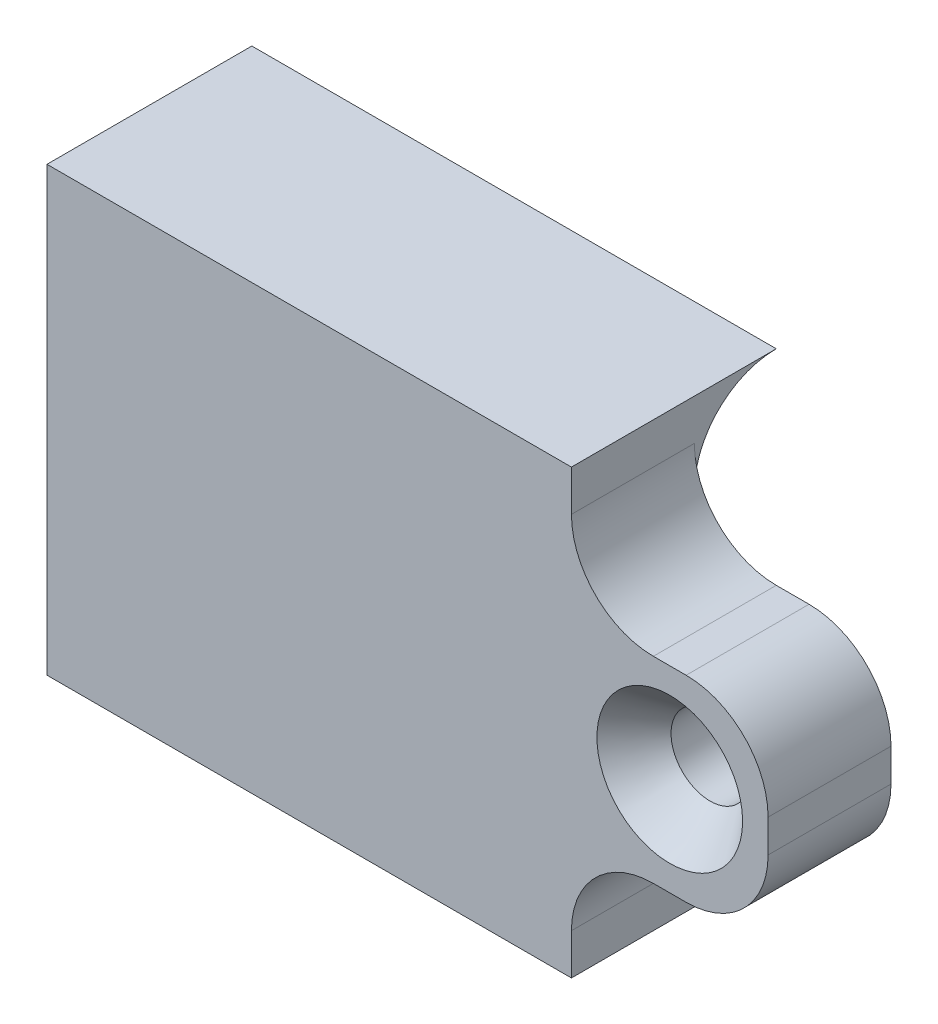
ISO-10303-21;
HEADER;
FILE_DESCRIPTION(('STEP AP214'),'2;1');
FILE_NAME('part.step','',(''),(''),'','','');
FILE_SCHEMA(('AUTOMOTIVE_DESIGN { 1 0 10303 214 1 1 1 1 }'));
ENDSEC;
DATA;
#1=APPLICATION_CONTEXT('core data for automotive mechanical design processes');
#2=APPLICATION_PROTOCOL_DEFINITION('international standard','automotive_design',2000,#1);
#3=PRODUCT_CONTEXT('',#1,'mechanical');
#4=PRODUCT('Part','Part','',(#3));
#5=PRODUCT_RELATED_PRODUCT_CATEGORY('part','',(#4));
#6=PRODUCT_DEFINITION_FORMATION('','',#4);
#7=PRODUCT_DEFINITION_CONTEXT('part definition',#1,'design');
#8=PRODUCT_DEFINITION('design','',#6,#7);
#9=PRODUCT_DEFINITION_SHAPE('','',#8);
#10=(LENGTH_UNIT() NAMED_UNIT(*) SI_UNIT(.MILLI.,.METRE.));
#11=(NAMED_UNIT(*) PLANE_ANGLE_UNIT() SI_UNIT($,.RADIAN.));
#12=(NAMED_UNIT(*) SI_UNIT($,.STERADIAN.) SOLID_ANGLE_UNIT());
#13=UNCERTAINTY_MEASURE_WITH_UNIT(LENGTH_MEASURE(1.E-05),#10,'distance_accuracy_value','');
#14=(GEOMETRIC_REPRESENTATION_CONTEXT(3) GLOBAL_UNCERTAINTY_ASSIGNED_CONTEXT((#13)) GLOBAL_UNIT_ASSIGNED_CONTEXT((#10,
#11,#12)) REPRESENTATION_CONTEXT('',''));
#15=CARTESIAN_POINT('',(0.,0.,0.));
#16=DIRECTION('',(0.,0.,1.));
#17=DIRECTION('',(1.,0.,0.));
#18=AXIS2_PLACEMENT_3D('',#15,#16,#17);
#19=CARTESIAN_POINT('',(0.,0.,-1.5));
#20=DIRECTION('',(0.,0.,1.));
#21=DIRECTION('',(1.,0.,0.));
#22=AXIS2_PLACEMENT_3D('',#19,#20,#21);
#23=PLANE('',#22);
#24=CARTESIAN_POINT('',(8.8,0.,-1.5));
#25=DIRECTION('',(0.,0.,1.));
#26=DIRECTION('',(1.,0.,0.));
#27=AXIS2_PLACEMENT_3D('',#24,#25,#26);
#28=CIRCLE('',#27,0.952499999999999);
#29=CARTESIAN_POINT('',(9.7525,0.,-1.5));
#30=VERTEX_POINT('',#29);
#31=EDGE_CURVE('E182',#30,#30,#28,.T.);
#32=ORIENTED_EDGE('',*,*,#31,.T.);
#33=EDGE_LOOP('',(#32));
#34=FACE_BOUND('',#33,.T.);
#35=DIRECTION('',(0.,-1.,0.));
#36=VECTOR('',#35,1.);
#37=CARTESIAN_POINT('',(6.4,-5.4,-1.5));
#38=LINE('',#37,#36);
#39=CARTESIAN_POINT('',(6.4,-3.4,-1.5));
#40=VERTEX_POINT('',#39);
#41=CARTESIAN_POINT('',(6.4,-4.4,-1.5));
#42=VERTEX_POINT('',#41);
#43=EDGE_CURVE('E51',#40,#42,#38,.T.);
#44=ORIENTED_EDGE('',*,*,#43,.F.);
#45=DIRECTION('',(1.,0.,0.));
#46=VECTOR('',#45,1.);
#47=CARTESIAN_POINT('',(-9.22842712474619,-3.4,-1.5));
#48=LINE('',#47,#46);
#49=CARTESIAN_POINT('',(-6.4,-3.4,-1.5));
#50=VERTEX_POINT('',#49);
#51=EDGE_CURVE('E55',#50,#40,#48,.T.);
#52=ORIENTED_EDGE('',*,*,#51,.F.);
#53=DIRECTION('',(0.,-1.,0.));
#54=VECTOR('',#53,1.);
#55=CARTESIAN_POINT('',(-6.4,0.,-1.5));
#56=LINE('',#55,#54);
#57=CARTESIAN_POINT('',(-6.4,3.4,-1.5));
#58=VERTEX_POINT('',#57);
#59=EDGE_CURVE('E185',#58,#50,#56,.T.);
#60=ORIENTED_EDGE('',*,*,#59,.F.);
#61=DIRECTION('',(1.,0.,0.));
#62=VECTOR('',#61,1.);
#63=CARTESIAN_POINT('',(-9.22842712474619,3.4,-1.5));
#64=LINE('',#63,#62);
#65=CARTESIAN_POINT('',(6.4,3.4,-1.5));
#66=VERTEX_POINT('',#65);
#67=EDGE_CURVE('E166',#58,#66,#64,.T.);
#68=ORIENTED_EDGE('',*,*,#67,.T.);
#69=DIRECTION('',(0.,-1.,0.));
#70=VECTOR('',#69,1.);
#71=CARTESIAN_POINT('',(6.4,5.4,-1.5));
#72=LINE('',#71,#70);
#73=CARTESIAN_POINT('',(6.4,4.4,-1.5));
#74=VERTEX_POINT('',#73);
#75=EDGE_CURVE('E160',#74,#66,#72,.T.);
#76=ORIENTED_EDGE('',*,*,#75,.F.);
#77=CARTESIAN_POINT('',(8.4,4.4,-1.5));
#78=DIRECTION('',(0.,0.,1.));
#79=DIRECTION('',(1.,0.,0.));
#80=AXIS2_PLACEMENT_3D('',#77,#78,#79);
#81=CIRCLE('',#80,2.);
#82=CARTESIAN_POINT('',(8.4,2.4,-1.5));
#83=VERTEX_POINT('',#82);
#84=EDGE_CURVE('E44',#74,#83,#81,.T.);
#85=ORIENTED_EDGE('',*,*,#84,.T.);
#86=DIRECTION('',(1.,0.,0.));
#87=VECTOR('',#86,1.);
#88=CARTESIAN_POINT('',(0.,2.4,-1.5));
#89=LINE('',#88,#87);
#90=CARTESIAN_POINT('',(9.2,2.4,-1.5));
#91=VERTEX_POINT('',#90);
#92=EDGE_CURVE('E190',#83,#91,#89,.T.);
#93=ORIENTED_EDGE('',*,*,#92,.T.);
#94=CARTESIAN_POINT('',(9.2,0.4,-1.5));
#95=DIRECTION('',(0.,0.,1.));
#96=DIRECTION('',(1.,0.,0.));
#97=AXIS2_PLACEMENT_3D('',#94,#95,#96);
#98=CIRCLE('',#97,2.);
#99=CARTESIAN_POINT('',(11.2,0.4,-1.5));
#100=VERTEX_POINT('',#99);
#101=EDGE_CURVE('E224',#91,#100,#98,.F.);
#102=ORIENTED_EDGE('',*,*,#101,.T.);
#103=DIRECTION('',(0.,-1.,0.));
#104=VECTOR('',#103,1.);
#105=CARTESIAN_POINT('',(11.2,0.,-1.5));
#106=LINE('',#105,#104);
#107=CARTESIAN_POINT('',(11.2,-0.4,-1.5));
#108=VERTEX_POINT('',#107);
#109=EDGE_CURVE('E209',#100,#108,#106,.T.);
#110=ORIENTED_EDGE('',*,*,#109,.T.);
#111=CARTESIAN_POINT('',(9.2,-0.4,-1.5));
#112=DIRECTION('',(0.,0.,1.));
#113=DIRECTION('',(1.,0.,0.));
#114=AXIS2_PLACEMENT_3D('',#111,#112,#113);
#115=CIRCLE('',#114,2.);
#116=CARTESIAN_POINT('',(9.2,-2.4,-1.5));
#117=VERTEX_POINT('',#116);
#118=EDGE_CURVE('E226',#108,#117,#115,.F.);
#119=ORIENTED_EDGE('',*,*,#118,.T.);
#120=DIRECTION('',(1.,0.,0.));
#121=VECTOR('',#120,1.);
#122=CARTESIAN_POINT('',(0.,-2.4,-1.5));
#123=LINE('',#122,#121);
#124=CARTESIAN_POINT('',(8.4,-2.4,-1.5));
#125=VERTEX_POINT('',#124);
#126=EDGE_CURVE('E206',#125,#117,#123,.T.);
#127=ORIENTED_EDGE('',*,*,#126,.F.);
#128=CARTESIAN_POINT('',(8.4,-4.4,-1.5));
#129=DIRECTION('',(0.,0.,1.));
#130=DIRECTION('',(1.,0.,0.));
#131=AXIS2_PLACEMENT_3D('',#128,#129,#130);
#132=CIRCLE('',#131,2.);
#133=EDGE_CURVE('E246',#125,#42,#132,.T.);
#134=ORIENTED_EDGE('',*,*,#133,.T.);
#135=EDGE_LOOP('',(#44,#52,#60,#68,#76,#85,#93,#102,#110,#119,#127,#134));
#136=FACE_BOUND('',#135,.T.);
#137=ADVANCED_FACE('F36',(#34,#136),#23,.F.);
#138=CARTESIAN_POINT('',(6.4,0.,1.5));
#139=DIRECTION('',(1.,0.,0.));
#140=DIRECTION('',(0.,0.,-1.));
#141=AXIS2_PLACEMENT_3D('',#138,#139,#140);
#142=PLANE('',#141);
#143=DIRECTION('',(0.,-1.,0.));
#144=VECTOR('',#143,1.);
#145=CARTESIAN_POINT('',(6.4,0.,1.5));
#146=LINE('',#145,#144);
#147=CARTESIAN_POINT('',(6.4,5.4,1.5));
#148=VERTEX_POINT('',#147);
#149=CARTESIAN_POINT('',(6.4,4.4,1.5));
#150=VERTEX_POINT('',#149);
#151=EDGE_CURVE('E186',#148,#150,#146,.T.);
#152=ORIENTED_EDGE('',*,*,#151,.T.);
#153=DIRECTION('',(0.,0.,-1.));
#154=VECTOR('',#153,1.);
#155=CARTESIAN_POINT('',(6.4,4.4,-1.5));
#156=LINE('',#155,#154);
#157=EDGE_CURVE('E244',#150,#74,#156,.T.);
#158=ORIENTED_EDGE('',*,*,#157,.T.);
#159=ORIENTED_EDGE('',*,*,#75,.T.);
#160=CARTESIAN_POINT('',(6.4,3.4,-3.5));
#161=DIRECTION('',(1.,0.,0.));
#162=DIRECTION('',(0.,0.,-1.));
#163=AXIS2_PLACEMENT_3D('',#160,#161,#162);
#164=CIRCLE('',#163,2.);
#165=CARTESIAN_POINT('',(6.4,5.4,-3.5));
#166=VERTEX_POINT('',#165);
#167=EDGE_CURVE('E163',#66,#166,#164,.F.);
#168=ORIENTED_EDGE('',*,*,#167,.T.);
#169=DIRECTION('',(0.,0.,-1.));
#170=VECTOR('',#169,1.);
#171=CARTESIAN_POINT('',(6.4,5.4,1.5));
#172=LINE('',#171,#170);
#173=EDGE_CURVE('E217',#148,#166,#172,.T.);
#174=ORIENTED_EDGE('',*,*,#173,.F.);
#175=EDGE_LOOP('',(#152,#158,#159,#168,#174));
#176=FACE_BOUND('',#175,.T.);
#177=ADVANCED_FACE('F265',(#176),#142,.T.);
#178=CARTESIAN_POINT('',(0.,5.4,1.5));
#179=DIRECTION('',(0.,1.,0.));
#180=DIRECTION('',(0.,0.,1.));
#181=AXIS2_PLACEMENT_3D('',#178,#179,#180);
#182=PLANE('',#181);
#183=ORIENTED_EDGE('',*,*,#173,.T.);
#184=DIRECTION('',(1.,0.,0.));
#185=VECTOR('',#184,1.);
#186=CARTESIAN_POINT('',(-9.22842712474619,5.4,-3.5));
#187=LINE('',#186,#185);
#188=CARTESIAN_POINT('',(-6.4,5.4,-3.5));
#189=VERTEX_POINT('',#188);
#190=EDGE_CURVE('E169',#189,#166,#187,.T.);
#191=ORIENTED_EDGE('',*,*,#190,.F.);
#192=DIRECTION('',(0.,0.,-1.));
#193=VECTOR('',#192,1.);
#194=CARTESIAN_POINT('',(-6.4,5.4,1.5));
#195=LINE('',#194,#193);
#196=CARTESIAN_POINT('',(-6.4,5.4,1.5));
#197=VERTEX_POINT('',#196);
#198=EDGE_CURVE('E215',#197,#189,#195,.T.);
#199=ORIENTED_EDGE('',*,*,#198,.F.);
#200=DIRECTION('',(1.,0.,0.));
#201=VECTOR('',#200,1.);
#202=CARTESIAN_POINT('',(0.,5.4,1.5));
#203=LINE('',#202,#201);
#204=EDGE_CURVE('E189',#197,#148,#203,.T.);
#205=ORIENTED_EDGE('',*,*,#204,.T.);
#206=EDGE_LOOP('',(#183,#191,#199,#205));
#207=FACE_BOUND('',#206,.T.);
#208=ADVANCED_FACE('F269',(#207),#182,.T.);
#209=CARTESIAN_POINT('',(-6.4,0.,1.5));
#210=DIRECTION('',(1.,0.,0.));
#211=DIRECTION('',(0.,1.,0.));
#212=AXIS2_PLACEMENT_3D('',#209,#210,#211);
#213=PLANE('',#212);
#214=ORIENTED_EDGE('',*,*,#198,.T.);
#215=CARTESIAN_POINT('',(-6.4,3.4,-3.5));
#216=DIRECTION('',(1.,0.,0.));
#217=DIRECTION('',(0.,1.,0.));
#218=AXIS2_PLACEMENT_3D('',#215,#216,#217);
#219=CIRCLE('',#218,2.);
#220=EDGE_CURVE('E172',#189,#58,#219,.T.);
#221=ORIENTED_EDGE('',*,*,#220,.T.);
#222=ORIENTED_EDGE('',*,*,#59,.T.);
#223=CARTESIAN_POINT('',(-6.4,-3.4,-3.5));
#224=DIRECTION('',(1.,0.,0.));
#225=DIRECTION('',(0.,1.,0.));
#226=AXIS2_PLACEMENT_3D('',#223,#224,#225);
#227=CIRCLE('',#226,2.);
#228=CARTESIAN_POINT('',(-6.4,-5.4,-3.5));
#229=VERTEX_POINT('',#228);
#230=EDGE_CURVE('E154',#50,#229,#227,.T.);
#231=ORIENTED_EDGE('',*,*,#230,.T.);
#232=DIRECTION('',(0.,0.,-1.));
#233=VECTOR('',#232,1.);
#234=CARTESIAN_POINT('',(-6.4,-5.4,1.5));
#235=LINE('',#234,#233);
#236=CARTESIAN_POINT('',(-6.4,-5.4,1.5));
#237=VERTEX_POINT('',#236);
#238=EDGE_CURVE('E144',#237,#229,#235,.T.);
#239=ORIENTED_EDGE('',*,*,#238,.F.);
#240=DIRECTION('',(0.,-1.,0.));
#241=VECTOR('',#240,1.);
#242=CARTESIAN_POINT('',(-6.4,0.,1.5));
#243=LINE('',#242,#241);
#244=EDGE_CURVE('E193',#197,#237,#243,.T.);
#245=ORIENTED_EDGE('',*,*,#244,.F.);
#246=EDGE_LOOP('',(#214,#221,#222,#231,#239,#245));
#247=FACE_BOUND('',#246,.T.);
#248=ADVANCED_FACE('F275',(#247),#213,.F.);
#249=CARTESIAN_POINT('',(0.,-5.4,1.5));
#250=DIRECTION('',(0.,1.,0.));
#251=DIRECTION('',(0.,0.,1.));
#252=AXIS2_PLACEMENT_3D('',#249,#250,#251);
#253=PLANE('',#252);
#254=ORIENTED_EDGE('',*,*,#238,.T.);
#255=DIRECTION('',(1.,0.,0.));
#256=VECTOR('',#255,1.);
#257=CARTESIAN_POINT('',(-9.22842712474619,-5.4,-3.5));
#258=LINE('',#257,#256);
#259=CARTESIAN_POINT('',(6.4,-5.4,-3.5));
#260=VERTEX_POINT('',#259);
#261=EDGE_CURVE('E148',#229,#260,#258,.T.);
#262=ORIENTED_EDGE('',*,*,#261,.T.);
#263=DIRECTION('',(0.,0.,-1.));
#264=VECTOR('',#263,1.);
#265=CARTESIAN_POINT('',(6.4,-5.4,1.5));
#266=LINE('',#265,#264);
#267=CARTESIAN_POINT('',(6.4,-5.4,1.5));
#268=VERTEX_POINT('',#267);
#269=EDGE_CURVE('E134',#268,#260,#266,.T.);
#270=ORIENTED_EDGE('',*,*,#269,.F.);
#271=DIRECTION('',(1.,0.,0.));
#272=VECTOR('',#271,1.);
#273=CARTESIAN_POINT('',(0.,-5.4,1.5));
#274=LINE('',#273,#272);
#275=EDGE_CURVE('E195',#237,#268,#274,.T.);
#276=ORIENTED_EDGE('',*,*,#275,.F.);
#277=EDGE_LOOP('',(#254,#262,#270,#276));
#278=FACE_BOUND('',#277,.T.);
#279=ADVANCED_FACE('F149',(#278),#253,.F.);
#280=ORIENTED_EDGE('',*,*,#269,.T.);
#281=CARTESIAN_POINT('',(6.4,-3.4,-3.5));
#282=DIRECTION('',(1.,0.,0.));
#283=DIRECTION('',(0.,0.,-1.));
#284=AXIS2_PLACEMENT_3D('',#281,#282,#283);
#285=CIRCLE('',#284,2.);
#286=EDGE_CURVE('E138',#260,#40,#285,.F.);
#287=ORIENTED_EDGE('',*,*,#286,.T.);
#288=ORIENTED_EDGE('',*,*,#43,.T.);
#289=DIRECTION('',(0.,0.,-1.));
#290=VECTOR('',#289,1.);
#291=CARTESIAN_POINT('',(6.4,-4.4,1.5));
#292=LINE('',#291,#290);
#293=CARTESIAN_POINT('',(6.4,-4.4,1.5));
#294=VERTEX_POINT('',#293);
#295=EDGE_CURVE('E237',#42,#294,#292,.F.);
#296=ORIENTED_EDGE('',*,*,#295,.T.);
#297=EDGE_CURVE('E140',#294,#268,#146,.T.);
#298=ORIENTED_EDGE('',*,*,#297,.T.);
#299=EDGE_LOOP('',(#280,#287,#288,#296,#298));
#300=FACE_BOUND('',#299,.T.);
#301=ADVANCED_FACE('F136',(#300),#142,.T.);
#302=CARTESIAN_POINT('',(0.,-2.4,1.5));
#303=DIRECTION('',(0.,1.,0.));
#304=DIRECTION('',(0.,0.,1.));
#305=AXIS2_PLACEMENT_3D('',#302,#303,#304);
#306=PLANE('',#305);
#307=ORIENTED_EDGE('',*,*,#126,.T.);
#308=DIRECTION('',(0.,0.,-1.));
#309=VECTOR('',#308,1.);
#310=CARTESIAN_POINT('',(9.2,-2.4,1.5));
#311=LINE('',#310,#309);
#312=CARTESIAN_POINT('',(9.2,-2.4,1.5));
#313=VERTEX_POINT('',#312);
#314=EDGE_CURVE('E231',#117,#313,#311,.F.);
#315=ORIENTED_EDGE('',*,*,#314,.T.);
#316=DIRECTION('',(1.,0.,0.));
#317=VECTOR('',#316,1.);
#318=CARTESIAN_POINT('',(0.,-2.4,1.5));
#319=LINE('',#318,#317);
#320=CARTESIAN_POINT('',(8.4,-2.4,1.5));
#321=VERTEX_POINT('',#320);
#322=EDGE_CURVE('E197',#321,#313,#319,.T.);
#323=ORIENTED_EDGE('',*,*,#322,.F.);
#324=DIRECTION('',(0.,0.,-1.));
#325=VECTOR('',#324,1.);
#326=CARTESIAN_POINT('',(8.4,-2.4,1.5));
#327=LINE('',#326,#325);
#328=EDGE_CURVE('E228',#321,#125,#327,.T.);
#329=ORIENTED_EDGE('',*,*,#328,.T.);
#330=EDGE_LOOP('',(#307,#315,#323,#329));
#331=FACE_BOUND('',#330,.T.);
#332=ADVANCED_FACE('F285',(#331),#306,.F.);
#333=CARTESIAN_POINT('',(11.2,0.,1.5));
#334=DIRECTION('',(1.,0.,0.));
#335=DIRECTION('',(0.,0.,-1.));
#336=AXIS2_PLACEMENT_3D('',#333,#334,#335);
#337=PLANE('',#336);
#338=DIRECTION('',(0.,-1.,0.));
#339=VECTOR('',#338,1.);
#340=CARTESIAN_POINT('',(11.2,0.,1.5));
#341=LINE('',#340,#339);
#342=CARTESIAN_POINT('',(11.2,0.4,1.5));
#343=VERTEX_POINT('',#342);
#344=CARTESIAN_POINT('',(11.2,-0.4,1.5));
#345=VERTEX_POINT('',#344);
#346=EDGE_CURVE('E200',#343,#345,#341,.T.);
#347=ORIENTED_EDGE('',*,*,#346,.T.);
#348=DIRECTION('',(0.,0.,-1.));
#349=VECTOR('',#348,1.);
#350=CARTESIAN_POINT('',(11.2,-0.4,-1.5));
#351=LINE('',#350,#349);
#352=EDGE_CURVE('E221',#345,#108,#351,.T.);
#353=ORIENTED_EDGE('',*,*,#352,.T.);
#354=ORIENTED_EDGE('',*,*,#109,.F.);
#355=DIRECTION('',(0.,0.,-1.));
#356=VECTOR('',#355,1.);
#357=CARTESIAN_POINT('',(11.2,0.4,1.5));
#358=LINE('',#357,#356);
#359=EDGE_CURVE('E219',#100,#343,#358,.F.);
#360=ORIENTED_EDGE('',*,*,#359,.T.);
#361=EDGE_LOOP('',(#347,#353,#354,#360));
#362=FACE_BOUND('',#361,.T.);
#363=ADVANCED_FACE('F293',(#362),#337,.T.);
#364=CARTESIAN_POINT('',(0.,2.4,1.5));
#365=DIRECTION('',(0.,1.,0.));
#366=DIRECTION('',(0.,0.,1.));
#367=AXIS2_PLACEMENT_3D('',#364,#365,#366);
#368=PLANE('',#367);
#369=DIRECTION('',(1.,0.,0.));
#370=VECTOR('',#369,1.);
#371=CARTESIAN_POINT('',(0.,2.4,1.5));
#372=LINE('',#371,#370);
#373=CARTESIAN_POINT('',(8.4,2.4,1.5));
#374=VERTEX_POINT('',#373);
#375=CARTESIAN_POINT('',(9.2,2.4,1.5));
#376=VERTEX_POINT('',#375);
#377=EDGE_CURVE('E145',#374,#376,#372,.T.);
#378=ORIENTED_EDGE('',*,*,#377,.T.);
#379=DIRECTION('',(0.,0.,-1.));
#380=VECTOR('',#379,1.);
#381=CARTESIAN_POINT('',(9.2,2.4,1.5));
#382=LINE('',#381,#380);
#383=EDGE_CURVE('E241',#376,#91,#382,.T.);
#384=ORIENTED_EDGE('',*,*,#383,.T.);
#385=ORIENTED_EDGE('',*,*,#92,.F.);
#386=DIRECTION('',(0.,0.,-1.));
#387=VECTOR('',#386,1.);
#388=CARTESIAN_POINT('',(8.4,2.4,1.5));
#389=LINE('',#388,#387);
#390=EDGE_CURVE('E239',#83,#374,#389,.F.);
#391=ORIENTED_EDGE('',*,*,#390,.T.);
#392=EDGE_LOOP('',(#378,#384,#385,#391));
#393=FACE_BOUND('',#392,.T.);
#394=ADVANCED_FACE('F256',(#393),#368,.T.);
#395=CARTESIAN_POINT('',(0.,0.,1.5));
#396=DIRECTION('',(0.,0.,1.));
#397=DIRECTION('',(1.,0.,0.));
#398=AXIS2_PLACEMENT_3D('',#395,#396,#397);
#399=PLANE('',#398);
#400=CARTESIAN_POINT('',(8.8,0.,1.5));
#401=DIRECTION('',(0.,0.,1.));
#402=DIRECTION('',(1.,0.,0.));
#403=AXIS2_PLACEMENT_3D('',#400,#401,#402);
#404=CIRCLE('',#403,1.778);
#405=CARTESIAN_POINT('',(10.578,0.,1.5));
#406=VERTEX_POINT('',#405);
#407=EDGE_CURVE('E176',#406,#406,#404,.T.);
#408=ORIENTED_EDGE('',*,*,#407,.F.);
#409=EDGE_LOOP('',(#408));
#410=FACE_BOUND('',#409,.T.);
#411=ORIENTED_EDGE('',*,*,#322,.T.);
#412=CARTESIAN_POINT('',(9.2,-0.4,1.5));
#413=DIRECTION('',(0.,0.,1.));
#414=DIRECTION('',(1.,0.,0.));
#415=AXIS2_PLACEMENT_3D('',#412,#413,#414);
#416=CIRCLE('',#415,2.);
#417=EDGE_CURVE('E235',#313,#345,#416,.T.);
#418=ORIENTED_EDGE('',*,*,#417,.T.);
#419=ORIENTED_EDGE('',*,*,#346,.F.);
#420=CARTESIAN_POINT('',(9.2,0.4,1.5));
#421=DIRECTION('',(0.,0.,1.));
#422=DIRECTION('',(1.,0.,0.));
#423=AXIS2_PLACEMENT_3D('',#420,#421,#422);
#424=CIRCLE('',#423,2.);
#425=EDGE_CURVE('E233',#343,#376,#424,.T.);
#426=ORIENTED_EDGE('',*,*,#425,.T.);
#427=ORIENTED_EDGE('',*,*,#377,.F.);
#428=CARTESIAN_POINT('',(8.4,4.4,1.5));
#429=DIRECTION('',(0.,0.,1.));
#430=DIRECTION('',(1.,0.,0.));
#431=AXIS2_PLACEMENT_3D('',#428,#429,#430);
#432=CIRCLE('',#431,2.);
#433=EDGE_CURVE('E11',#374,#150,#432,.F.);
#434=ORIENTED_EDGE('',*,*,#433,.T.);
#435=ORIENTED_EDGE('',*,*,#151,.F.);
#436=ORIENTED_EDGE('',*,*,#204,.F.);
#437=ORIENTED_EDGE('',*,*,#244,.T.);
#438=ORIENTED_EDGE('',*,*,#275,.T.);
#439=ORIENTED_EDGE('',*,*,#297,.F.);
#440=CARTESIAN_POINT('',(8.4,-4.4,1.5));
#441=DIRECTION('',(0.,0.,1.));
#442=DIRECTION('',(1.,0.,0.));
#443=AXIS2_PLACEMENT_3D('',#440,#441,#442);
#444=CIRCLE('',#443,2.);
#445=EDGE_CURVE('E248',#294,#321,#444,.F.);
#446=ORIENTED_EDGE('',*,*,#445,.T.);
#447=EDGE_LOOP('',(#411,#418,#419,#426,#427,#434,#435,#436,#437,#438,#439,#446));
#448=FACE_BOUND('',#447,.T.);
#449=ADVANCED_FACE('F262',(#410,#448),#399,.T.);
#450=CARTESIAN_POINT('',(8.8,0.,1.5));
#451=DIRECTION('',(0.,0.,1.));
#452=DIRECTION('',(1.,0.,0.));
#453=AXIS2_PLACEMENT_3D('',#450,#451,#452);
#454=CYLINDRICAL_SURFACE('',#453,0.952499999999999);
#455=ORIENTED_EDGE('',*,*,#31,.F.);
#456=EDGE_LOOP('',(#455));
#457=FACE_BOUND('',#456,.T.);
#458=CARTESIAN_POINT('',(8.8,0.,0.51620740931348));
#459=DIRECTION('',(0.,0.,1.));
#460=DIRECTION('',(1.,0.,0.));
#461=AXIS2_PLACEMENT_3D('',#458,#459,#460);
#462=CIRCLE('',#461,0.9525);
#463=CARTESIAN_POINT('',(9.7525,0.,0.51620740931348));
#464=VERTEX_POINT('',#463);
#465=EDGE_CURVE('E179',#464,#464,#462,.T.);
#466=ORIENTED_EDGE('',*,*,#465,.T.);
#467=EDGE_LOOP('',(#466));
#468=FACE_BOUND('',#467,.T.);
#469=ADVANCED_FACE('F333',(#457,#468),#454,.F.);
#470=CARTESIAN_POINT('',(8.8,0.,1.5));
#471=DIRECTION('',(0.,0.,1.));
#472=DIRECTION('',(1.,0.,0.));
#473=AXIS2_PLACEMENT_3D('',#470,#471,#472);
#474=CONICAL_SURFACE('',#473,1.778,0.698131700797732);
#475=ORIENTED_EDGE('',*,*,#465,.F.);
#476=EDGE_LOOP('',(#475));
#477=FACE_BOUND('',#476,.T.);
#478=ORIENTED_EDGE('',*,*,#407,.T.);
#479=EDGE_LOOP('',(#478));
#480=FACE_BOUND('',#479,.T.);
#481=ADVANCED_FACE('F329',(#477,#480),#474,.F.);
#482=CARTESIAN_POINT('',(9.2,-0.4,1.5));
#483=DIRECTION('',(0.,0.,1.));
#484=DIRECTION('',(1.,0.,0.));
#485=AXIS2_PLACEMENT_3D('',#482,#483,#484);
#486=CYLINDRICAL_SURFACE('',#485,2.);
#487=ORIENTED_EDGE('',*,*,#417,.F.);
#488=ORIENTED_EDGE('',*,*,#314,.F.);
#489=ORIENTED_EDGE('',*,*,#118,.F.);
#490=ORIENTED_EDGE('',*,*,#352,.F.);
#491=EDGE_LOOP('',(#487,#488,#489,#490));
#492=FACE_BOUND('',#491,.T.);
#493=ADVANCED_FACE('F291',(#492),#486,.T.);
#494=CARTESIAN_POINT('',(8.4,-4.4,1.5));
#495=DIRECTION('',(0.,0.,-1.));
#496=DIRECTION('',(-1.,0.,0.));
#497=AXIS2_PLACEMENT_3D('',#494,#495,#496);
#498=CYLINDRICAL_SURFACE('',#497,2.);
#499=ORIENTED_EDGE('',*,*,#445,.F.);
#500=ORIENTED_EDGE('',*,*,#295,.F.);
#501=ORIENTED_EDGE('',*,*,#133,.F.);
#502=ORIENTED_EDGE('',*,*,#328,.F.);
#503=EDGE_LOOP('',(#499,#500,#501,#502));
#504=FACE_BOUND('',#503,.T.);
#505=ADVANCED_FACE('F282',(#504),#498,.F.);
#506=CARTESIAN_POINT('',(9.2,0.4,1.5));
#507=DIRECTION('',(0.,0.,-1.));
#508=DIRECTION('',(-1.,0.,0.));
#509=AXIS2_PLACEMENT_3D('',#506,#507,#508);
#510=CYLINDRICAL_SURFACE('',#509,2.);
#511=ORIENTED_EDGE('',*,*,#425,.F.);
#512=ORIENTED_EDGE('',*,*,#359,.F.);
#513=ORIENTED_EDGE('',*,*,#101,.F.);
#514=ORIENTED_EDGE('',*,*,#383,.F.);
#515=EDGE_LOOP('',(#511,#512,#513,#514));
#516=FACE_BOUND('',#515,.T.);
#517=ADVANCED_FACE('F298',(#516),#510,.T.);
#518=CARTESIAN_POINT('',(8.4,4.4,1.5));
#519=DIRECTION('',(0.,0.,1.));
#520=DIRECTION('',(1.,0.,0.));
#521=AXIS2_PLACEMENT_3D('',#518,#519,#520);
#522=CYLINDRICAL_SURFACE('',#521,2.);
#523=ORIENTED_EDGE('',*,*,#433,.F.);
#524=ORIENTED_EDGE('',*,*,#390,.F.);
#525=ORIENTED_EDGE('',*,*,#84,.F.);
#526=ORIENTED_EDGE('',*,*,#157,.F.);
#527=EDGE_LOOP('',(#523,#524,#525,#526));
#528=FACE_BOUND('',#527,.T.);
#529=ADVANCED_FACE('F38',(#528),#522,.F.);
#530=CARTESIAN_POINT('',(-9.22842712474619,3.4,-3.5));
#531=DIRECTION('',(1.,0.,0.));
#532=DIRECTION('',(0.,0.,-1.));
#533=AXIS2_PLACEMENT_3D('',#530,#531,#532);
#534=CYLINDRICAL_SURFACE('',#533,2.);
#535=ORIENTED_EDGE('',*,*,#220,.F.);
#536=ORIENTED_EDGE('',*,*,#190,.T.);
#537=ORIENTED_EDGE('',*,*,#167,.F.);
#538=ORIENTED_EDGE('',*,*,#67,.F.);
#539=EDGE_LOOP('',(#535,#536,#537,#538));
#540=FACE_BOUND('',#539,.T.);
#541=ADVANCED_FACE('F272',(#540),#534,.F.);
#542=CARTESIAN_POINT('',(-9.22842712474619,-3.4,-3.5));
#543=DIRECTION('',(1.,0.,0.));
#544=DIRECTION('',(0.,0.,-1.));
#545=AXIS2_PLACEMENT_3D('',#542,#543,#544);
#546=CYLINDRICAL_SURFACE('',#545,2.);
#547=ORIENTED_EDGE('',*,*,#230,.F.);
#548=ORIENTED_EDGE('',*,*,#51,.T.);
#549=ORIENTED_EDGE('',*,*,#286,.F.);
#550=ORIENTED_EDGE('',*,*,#261,.F.);
#551=EDGE_LOOP('',(#547,#548,#549,#550));
#552=FACE_BOUND('',#551,.T.);
#553=ADVANCED_FACE('F156',(#552),#546,.F.);
#554=CLOSED_SHELL('',(#137,#177,#208,#248,#279,#301,#332,#363,#394,#449,#469,#481,#493,#505,
#517,#529,#541,#553));
#555=MANIFOLD_SOLID_BREP('B2',#554);
#556=ADVANCED_BREP_SHAPE_REPRESENTATION('',(#18,#555),#14);
#557=SHAPE_DEFINITION_REPRESENTATION(#9,#556);
ENDSEC;
END-ISO-10303-21;
